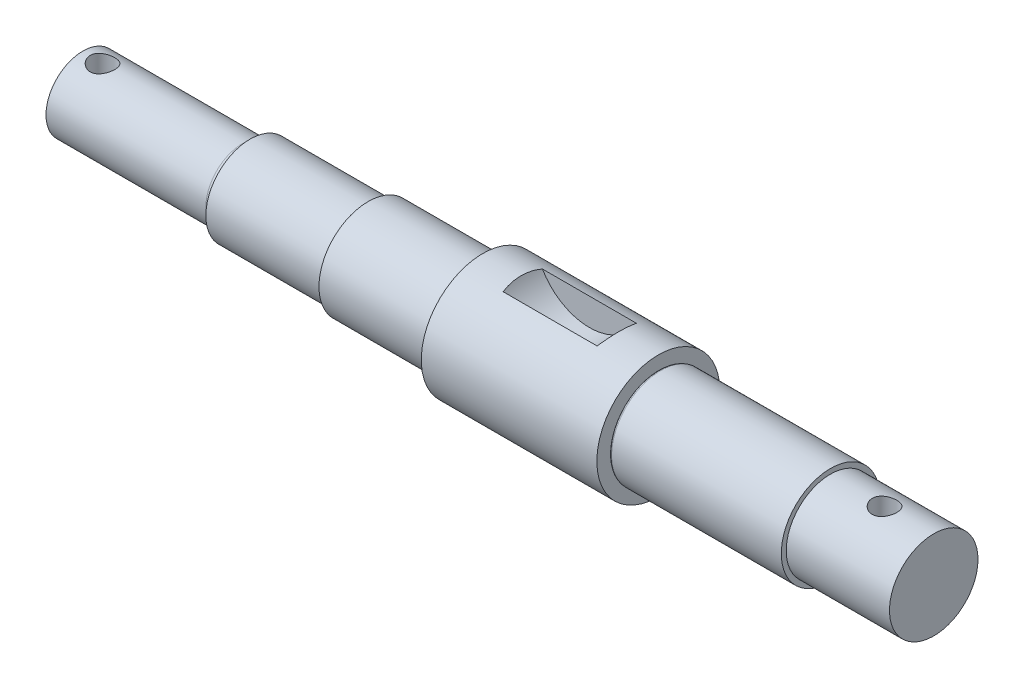
ISO-10303-21;
HEADER;
FILE_DESCRIPTION(('STEP AP214'),'2;1');
FILE_NAME('part.step','',(''),(''),'','','');
FILE_SCHEMA(('AUTOMOTIVE_DESIGN { 1 0 10303 214 1 1 1 1 }'));
ENDSEC;
DATA;
#1=APPLICATION_CONTEXT('core data for automotive mechanical design processes');
#2=APPLICATION_PROTOCOL_DEFINITION('international standard','automotive_design',2000,#1);
#3=PRODUCT_CONTEXT('',#1,'mechanical');
#4=PRODUCT('Part','Part','',(#3));
#5=PRODUCT_RELATED_PRODUCT_CATEGORY('part','',(#4));
#6=PRODUCT_DEFINITION_FORMATION('','',#4);
#7=PRODUCT_DEFINITION_CONTEXT('part definition',#1,'design');
#8=PRODUCT_DEFINITION('design','',#6,#7);
#9=PRODUCT_DEFINITION_SHAPE('','',#8);
#10=(LENGTH_UNIT() NAMED_UNIT(*) SI_UNIT(.MILLI.,.METRE.));
#11=(NAMED_UNIT(*) PLANE_ANGLE_UNIT() SI_UNIT($,.RADIAN.));
#12=(NAMED_UNIT(*) SI_UNIT($,.STERADIAN.) SOLID_ANGLE_UNIT());
#13=UNCERTAINTY_MEASURE_WITH_UNIT(LENGTH_MEASURE(1.E-05),#10,'distance_accuracy_value','');
#14=(GEOMETRIC_REPRESENTATION_CONTEXT(3) GLOBAL_UNCERTAINTY_ASSIGNED_CONTEXT((#13)) GLOBAL_UNIT_ASSIGNED_CONTEXT((#10,
#11,#12)) REPRESENTATION_CONTEXT('',''));
#15=CARTESIAN_POINT('',(0.,0.,0.));
#16=DIRECTION('',(0.,0.,1.));
#17=DIRECTION('',(1.,0.,0.));
#18=AXIS2_PLACEMENT_3D('',#15,#16,#17);
#19=CARTESIAN_POINT('',(-70.7,0.,0.));
#20=DIRECTION('',(1.,0.,0.));
#21=DIRECTION('',(0.,0.,-1.));
#22=AXIS2_PLACEMENT_3D('',#19,#20,#21);
#23=CYLINDRICAL_SURFACE('',#22,12.5);
#24=DIRECTION('',(1.,0.,0.));
#25=VECTOR('',#24,1.);
#26=CARTESIAN_POINT('',(-70.7,11.842719282327,4.));
#27=LINE('',#26,#25);
#28=CARTESIAN_POINT('',(-62.5508160472556,11.842719282327,4.));
#29=VERTEX_POINT('',#28);
#30=CARTESIAN_POINT('',(-43.4491839527444,11.842719282327,4.));
#31=VERTEX_POINT('',#30);
#32=EDGE_CURVE('E12',#29,#31,#27,.T.);
#33=ORIENTED_EDGE('',*,*,#32,.F.);
#34=CARTESIAN_POINT('',(-62.5508160472556,11.842719282327,4.));
#35=CARTESIAN_POINT('',(-62.5788073169737,11.8917156117758,3.85494402529168));
#36=CARTESIAN_POINT('',(-62.6048446524749,11.9381490672679,3.70867030879479));
#37=CARTESIAN_POINT('',(-62.6532244024329,12.0257437372073,3.41395853570055));
#38=CARTESIAN_POINT('',(-62.6755670398605,12.0669052697751,3.26552061029944));
#39=CARTESIAN_POINT('',(-62.7373575421085,12.1822344055781,2.81748164136339));
#40=CARTESIAN_POINT('',(-62.7715940017447,12.2482930461569,2.51501804161142));
#41=CARTESIAN_POINT('',(-62.8275364300656,12.3580046221654,1.90427101375401));
#42=CARTESIAN_POINT('',(-62.849214490821,12.4016076318492,1.59597618401057));
#43=CARTESIAN_POINT('',(-62.8808309020949,12.4656995854591,0.976382997723515));
#44=CARTESIAN_POINT('',(-62.8907689415353,12.4861879169095,0.665084561812988));
#45=CARTESIAN_POINT('',(-62.8993283672537,12.5038147620794,0.0418568247993382));
#46=CARTESIAN_POINT('',(-62.8979562431907,12.500966666014,-0.27007201186877));
#47=CARTESIAN_POINT('',(-62.8838499432114,12.4719806173032,-0.892642047172861));
#48=CARTESIAN_POINT('',(-62.8711140781979,12.4458392023584,-1.20328304748954));
#49=CARTESIAN_POINT('',(-62.8337853276926,12.3706573639039,-1.82020810943419));
#50=CARTESIAN_POINT('',(-62.8092242302907,12.3216783425543,-2.12650159839236));
#51=CARTESIAN_POINT('',(-62.7472667264495,12.201434168835,-2.7332260557265));
#52=CARTESIAN_POINT('',(-62.7098785640084,12.130183333244,-3.03366065887987));
#53=CARTESIAN_POINT('',(-62.6484087093215,12.0170604757192,-3.44296739669273));
#54=CARTESIAN_POINT('',(-62.6304071211959,11.9842876759461,-3.55535041723218));
#55=CARTESIAN_POINT('',(-62.5922518337805,11.9157411691357,-3.77872220549977));
#56=CARTESIAN_POINT('',(-62.5720999563678,11.8799700079478,-3.88971206587698));
#57=CARTESIAN_POINT('',(-62.5508160472556,11.842719282327,-4.));
#58=B_SPLINE_CURVE_WITH_KNOTS('',3,(#34,#35,#36,#37,#38,#39,#40,#41,#42,#43,#44,#45,#46,#47,#48,
#49,#50,#51,#52,#53,#54,#55,#56,#57),.UNSPECIFIED.,.F.,.F.,(4,2,2,2,2,2,2,2,2,2,2,4),(0.,
0.466853020500423,0.933677856670472,1.86688702951263,2.80216215102911,3.73746205419399,
4.67222532897255,5.60712756936481,6.53953055913783,7.4713354094899,7.82660392793133,
8.18157379263428),.UNSPECIFIED.);
#59=CARTESIAN_POINT('',(-62.5508160472556,11.842719282327,-4.));
#60=VERTEX_POINT('',#59);
#61=EDGE_CURVE('E55',#29,#60,#58,.T.);
#62=ORIENTED_EDGE('',*,*,#61,.T.);
#63=DIRECTION('',(1.,0.,0.));
#64=VECTOR('',#63,1.);
#65=CARTESIAN_POINT('',(-70.7,11.842719282327,-4.));
#66=LINE('',#65,#64);
#67=CARTESIAN_POINT('',(-43.4491839527444,11.842719282327,-4.));
#68=VERTEX_POINT('',#67);
#69=EDGE_CURVE('E73',#60,#68,#66,.T.);
#70=ORIENTED_EDGE('',*,*,#69,.T.);
#71=CARTESIAN_POINT('',(-43.4491839527444,11.842719282327,-4.));
#72=CARTESIAN_POINT('',(-43.4211926830263,11.8917156117758,-3.85494402529168));
#73=CARTESIAN_POINT('',(-43.3951553475251,11.9381490672679,-3.70867030879479));
#74=CARTESIAN_POINT('',(-43.3467755975671,12.0257437372073,-3.41395853570055));
#75=CARTESIAN_POINT('',(-43.3244329601395,12.0669052697751,-3.26552061029944));
#76=CARTESIAN_POINT('',(-43.2626424578915,12.1822344055781,-2.8174816413634));
#77=CARTESIAN_POINT('',(-43.2284059982553,12.2482930461569,-2.51501804161143));
#78=CARTESIAN_POINT('',(-43.1724635699344,12.3580046221654,-1.90427101375401));
#79=CARTESIAN_POINT('',(-43.150785509179,12.4016076318492,-1.59597618401057));
#80=CARTESIAN_POINT('',(-43.1191690979051,12.4656995854591,-0.976382997723515));
#81=CARTESIAN_POINT('',(-43.1092310584647,12.4861879169095,-0.665084561812988));
#82=CARTESIAN_POINT('',(-43.1006716327463,12.5038147620794,-0.0418568247993377));
#83=CARTESIAN_POINT('',(-43.1020437568093,12.500966666014,0.270072011868771));
#84=CARTESIAN_POINT('',(-43.1161500567886,12.4719806173032,0.892642047172861));
#85=CARTESIAN_POINT('',(-43.1288859218021,12.4458392023584,1.20328304748954));
#86=CARTESIAN_POINT('',(-43.1662146723074,12.3706573639039,1.82020810943419));
#87=CARTESIAN_POINT('',(-43.1907757697093,12.3216783425543,2.12650159839236));
#88=CARTESIAN_POINT('',(-43.2527332735505,12.201434168835,2.7332260557265));
#89=CARTESIAN_POINT('',(-43.2901214359916,12.130183333244,3.03366065887988));
#90=CARTESIAN_POINT('',(-43.3515912906785,12.0170604757192,3.44296739669273));
#91=CARTESIAN_POINT('',(-43.3695928788041,11.9842876759461,3.55535041723219));
#92=CARTESIAN_POINT('',(-43.4077481662195,11.9157411691357,3.77872220549976));
#93=CARTESIAN_POINT('',(-43.4279000436322,11.8799700079478,3.88971206587698));
#94=CARTESIAN_POINT('',(-43.4491839527444,11.842719282327,4.));
#95=B_SPLINE_CURVE_WITH_KNOTS('',3,(#71,#72,#73,#74,#75,#76,#77,#78,#79,#80,#81,#82,#83,#84,#85,
#86,#87,#88,#89,#90,#91,#92,#93,#94),.UNSPECIFIED.,.F.,.F.,(4,2,2,2,2,2,2,2,2,2,2,4),(0.,
0.466853020500425,0.93367785667047,1.86688702951263,2.80216215102911,3.73746205419399,
4.67222532897255,5.60712756936481,6.53953055913783,7.4713354094899,7.82660392793133,
8.18157379263428),.UNSPECIFIED.);
#96=EDGE_CURVE('E79',#68,#31,#95,.T.);
#97=ORIENTED_EDGE('',*,*,#96,.T.);
#98=EDGE_LOOP('',(#33,#62,#70,#97));
#99=FACE_BOUND('',#98,.T.);
#100=CARTESIAN_POINT('',(-70.7,0.,0.));
#101=DIRECTION('',(1.,0.,0.));
#102=DIRECTION('',(0.,0.,-1.));
#103=AXIS2_PLACEMENT_3D('',#100,#101,#102);
#104=CIRCLE('',#103,12.5);
#105=CARTESIAN_POINT('',(-70.7,0.,-12.5));
#106=VERTEX_POINT('',#105);
#107=EDGE_CURVE('E244',#106,#106,#104,.T.);
#108=ORIENTED_EDGE('',*,*,#107,.T.);
#109=EDGE_LOOP('',(#108));
#110=FACE_BOUND('',#109,.T.);
#111=CARTESIAN_POINT('',(-35.,0.,0.));
#112=DIRECTION('',(1.,0.,0.));
#113=DIRECTION('',(0.,0.,-1.));
#114=AXIS2_PLACEMENT_3D('',#111,#112,#113);
#115=CIRCLE('',#114,12.5);
#116=CARTESIAN_POINT('',(-35.,0.,-12.5));
#117=VERTEX_POINT('',#116);
#118=EDGE_CURVE('E251',#117,#117,#115,.T.);
#119=ORIENTED_EDGE('',*,*,#118,.F.);
#120=EDGE_LOOP('',(#119));
#121=FACE_BOUND('',#120,.T.);
#122=ADVANCED_FACE('F46',(#99,#110,#121),#23,.T.);
#123=CARTESIAN_POINT('',(-70.7,0.,0.));
#124=DIRECTION('',(1.,0.,0.));
#125=DIRECTION('',(0.,0.,-1.));
#126=AXIS2_PLACEMENT_3D('',#123,#124,#125);
#127=PLANE('',#126);
#128=CARTESIAN_POINT('',(-70.7,0.,0.));
#129=DIRECTION('',(1.,0.,0.));
#130=DIRECTION('',(0.,0.,-1.));
#131=AXIS2_PLACEMENT_3D('',#128,#129,#130);
#132=CIRCLE('',#131,10.5);
#133=CARTESIAN_POINT('',(-70.7,0.,-10.5));
#134=VERTEX_POINT('',#133);
#135=EDGE_CURVE('E80',#134,#134,#132,.T.);
#136=ORIENTED_EDGE('',*,*,#135,.T.);
#137=EDGE_LOOP('',(#136));
#138=FACE_BOUND('',#137,.T.);
#139=ORIENTED_EDGE('',*,*,#107,.F.);
#140=EDGE_LOOP('',(#139));
#141=FACE_BOUND('',#140,.T.);
#142=ADVANCED_FACE('F151',(#138,#141),#127,.F.);
#143=CARTESIAN_POINT('',(-35.,0.,0.));
#144=DIRECTION('',(1.,0.,0.));
#145=DIRECTION('',(0.,0.,-1.));
#146=AXIS2_PLACEMENT_3D('',#143,#144,#145);
#147=PLANE('',#146);
#148=ORIENTED_EDGE('',*,*,#118,.T.);
#149=EDGE_LOOP('',(#148));
#150=FACE_BOUND('',#149,.T.);
#151=ADVANCED_FACE('F149',(#150),#147,.T.);
#152=CARTESIAN_POINT('',(-94.,0.,0.));
#153=DIRECTION('',(1.,0.,0.));
#154=DIRECTION('',(0.,0.,-1.));
#155=AXIS2_PLACEMENT_3D('',#152,#153,#154);
#156=CYLINDRICAL_SURFACE('',#155,10.);
#157=CARTESIAN_POINT('',(-71.2,0.,0.));
#158=DIRECTION('',(1.,0.,0.));
#159=DIRECTION('',(0.,0.,-1.));
#160=AXIS2_PLACEMENT_3D('',#157,#158,#159);
#161=CIRCLE('',#160,10.);
#162=CARTESIAN_POINT('',(-71.2,0.,-10.));
#163=VERTEX_POINT('',#162);
#164=EDGE_CURVE('E243',#163,#163,#161,.F.);
#165=ORIENTED_EDGE('',*,*,#164,.T.);
#166=EDGE_LOOP('',(#165));
#167=FACE_BOUND('',#166,.T.);
#168=CARTESIAN_POINT('',(-94.,0.,0.));
#169=DIRECTION('',(-1.,0.,0.));
#170=DIRECTION('',(0.,0.,1.));
#171=AXIS2_PLACEMENT_3D('',#168,#169,#170);
#172=CIRCLE('',#171,10.);
#173=CARTESIAN_POINT('',(-94.,0.,10.));
#174=VERTEX_POINT('',#173);
#175=EDGE_CURVE('E265',#174,#174,#172,.T.);
#176=ORIENTED_EDGE('',*,*,#175,.F.);
#177=EDGE_LOOP('',(#176));
#178=FACE_BOUND('',#177,.T.);
#179=ADVANCED_FACE('F145',(#167,#178),#156,.T.);
#180=CARTESIAN_POINT('',(-94.,0.,0.));
#181=DIRECTION('',(-1.,0.,0.));
#182=DIRECTION('',(0.,0.,1.));
#183=AXIS2_PLACEMENT_3D('',#180,#181,#182);
#184=PLANE('',#183);
#185=CARTESIAN_POINT('',(-94.,0.,0.));
#186=DIRECTION('',(-1.,0.,0.));
#187=DIRECTION('',(0.,0.,1.));
#188=AXIS2_PLACEMENT_3D('',#185,#186,#187);
#189=CIRCLE('',#188,9.);
#190=CARTESIAN_POINT('',(-94.,0.,9.));
#191=VERTEX_POINT('',#190);
#192=EDGE_CURVE('E254',#191,#191,#189,.F.);
#193=ORIENTED_EDGE('',*,*,#192,.T.);
#194=EDGE_LOOP('',(#193));
#195=FACE_BOUND('',#194,.T.);
#196=ORIENTED_EDGE('',*,*,#175,.T.);
#197=EDGE_LOOP('',(#196));
#198=FACE_BOUND('',#197,.T.);
#199=ADVANCED_FACE('F141',(#195,#198),#184,.T.);
#200=CARTESIAN_POINT('',(-118.,0.,0.));
#201=DIRECTION('',(1.,0.,0.));
#202=DIRECTION('',(0.,0.,-1.));
#203=AXIS2_PLACEMENT_3D('',#200,#201,#202);
#204=CYLINDRICAL_SURFACE('',#203,9.);
#205=ORIENTED_EDGE('',*,*,#192,.F.);
#206=EDGE_LOOP('',(#205));
#207=FACE_BOUND('',#206,.T.);
#208=CARTESIAN_POINT('',(-118.,0.,0.));
#209=DIRECTION('',(-1.,0.,0.));
#210=DIRECTION('',(0.,0.,1.));
#211=AXIS2_PLACEMENT_3D('',#208,#209,#210);
#212=CIRCLE('',#211,9.);
#213=CARTESIAN_POINT('',(-118.,0.,9.));
#214=VERTEX_POINT('',#213);
#215=EDGE_CURVE('E237',#214,#214,#212,.T.);
#216=ORIENTED_EDGE('',*,*,#215,.F.);
#217=EDGE_LOOP('',(#216));
#218=FACE_BOUND('',#217,.T.);
#219=ADVANCED_FACE('F136',(#207,#218),#204,.T.);
#220=CARTESIAN_POINT('',(-102.,0.,0.));
#221=DIRECTION('',(-1.,0.,0.));
#222=DIRECTION('',(0.,0.,1.));
#223=AXIS2_PLACEMENT_3D('',#220,#221,#222);
#224=CYLINDRICAL_SURFACE('',#223,7.5);
#225=CARTESIAN_POINT('',(-148.,-7.07106781186548,2.5));
#226=CARTESIAN_POINT('',(-148.13617043709,-7.07106736326085,2.50000064486928));
#227=CARTESIAN_POINT('',(-148.272336999559,-7.07504423227144,2.4888369592138));
#228=CARTESIAN_POINT('',(-148.540636052486,-7.09043935203137,2.44462782922201));
#229=CARTESIAN_POINT('',(-148.672767874681,-7.10185882855472,2.41157878042099));
#230=CARTESIAN_POINT('',(-148.929067232493,-7.13070509221979,2.32488871421226));
#231=CARTESIAN_POINT('',(-149.053249823607,-7.14812009928305,2.27128805350811));
#232=CARTESIAN_POINT('',(-149.29090012137,-7.18697805025812,2.14515407110345));
#233=CARTESIAN_POINT('',(-149.404365456384,-7.20842188259031,2.07261657215046));
#234=CARTESIAN_POINT('',(-149.621799905846,-7.25386223518683,1.9076278661072));
#235=CARTESIAN_POINT('',(-149.725288571679,-7.27792237111609,1.81456085344481));
#236=CARTESIAN_POINT('',(-149.915517003062,-7.32534662002507,1.61246916803601));
#237=CARTESIAN_POINT('',(-150.002254078956,-7.34871062072404,1.50344193763096));
#238=CARTESIAN_POINT('',(-150.158697243324,-7.39284667304497,1.26901126991254));
#239=CARTESIAN_POINT('',(-150.227899926545,-7.41353519254013,1.14325477806133));
#240=CARTESIAN_POINT('',(-150.343978962819,-7.44923966927457,0.881078057468701));
#241=CARTESIAN_POINT('',(-150.390861332942,-7.46425715507505,0.744660714218043));
#242=CARTESIAN_POINT('',(-150.459339636581,-7.48647688579767,0.470072043583746));
#243=CARTESIAN_POINT('',(-150.481758615643,-7.49393286943898,0.332126887132431));
#244=CARTESIAN_POINT('',(-150.503290733402,-7.5010902054562,0.054244687060235));
#245=CARTESIAN_POINT('',(-150.502409879131,-7.50079355657239,-0.085691833859729));
#246=CARTESIAN_POINT('',(-150.477889363585,-7.49265099046828,-0.357758787984523));
#247=CARTESIAN_POINT('',(-150.455143678814,-7.48510161887793,-0.489980121479126));
#248=CARTESIAN_POINT('',(-150.389017547549,-7.46367418349329,-0.748608597055414));
#249=CARTESIAN_POINT('',(-150.34563570255,-7.44979569077954,-0.875015344448026));
#250=CARTESIAN_POINT('',(-150.238946706735,-7.41689175733061,-1.12038118710492));
#251=CARTESIAN_POINT('',(-150.175385153634,-7.39780106310039,-1.2392205524221));
#252=CARTESIAN_POINT('',(-150.030350736378,-7.35645982597298,-1.4648108138183));
#253=CARTESIAN_POINT('',(-149.948872891681,-7.33420840503667,-1.57155833596334));
#254=CARTESIAN_POINT('',(-149.765814016351,-7.28765479624742,-1.77525216637825));
#255=CARTESIAN_POINT('',(-149.663467105396,-7.26330537922195,-1.87150039266315));
#256=CARTESIAN_POINT('',(-149.443878185684,-7.21618338122252,-2.04569314899541));
#257=CARTESIAN_POINT('',(-149.32663388568,-7.19341104364039,-2.12363485820384));
#258=CARTESIAN_POINT('',(-149.078365935991,-7.15176312802781,-2.25996863758935));
#259=CARTESIAN_POINT('',(-148.947169671706,-7.1329477321187,-2.31806615905335));
#260=CARTESIAN_POINT('',(-148.676071514464,-7.10204127060962,-2.41110798317333));
#261=CARTESIAN_POINT('',(-148.536173296984,-7.08994738717732,-2.44606198936873));
#262=CARTESIAN_POINT('',(-148.258404111471,-7.07449090788963,-2.4904032052438));
#263=CARTESIAN_POINT('',(-148.120726438128,-7.0707590079689,-2.50087273876907));
#264=CARTESIAN_POINT('',(-147.845559627215,-7.07141680147961,-2.4990135972743));
#265=CARTESIAN_POINT('',(-147.70807045994,-7.07580501979536,-2.48668906306691));
#266=CARTESIAN_POINT('',(-147.44210758572,-7.09184045225748,-2.44056412888077));
#267=CARTESIAN_POINT('',(-147.313486424623,-7.10323313602101,-2.40751598495171));
#268=CARTESIAN_POINT('',(-147.063640984402,-7.13171384177557,-2.32178465640117));
#269=CARTESIAN_POINT('',(-146.942418021023,-7.14880287337099,-2.26909799090856));
#270=CARTESIAN_POINT('',(-146.706548947883,-7.18742193989467,-2.14368585184735));
#271=CARTESIAN_POINT('',(-146.592233393396,-7.2090756416407,-2.07037779589625));
#272=CARTESIAN_POINT('',(-146.377134869041,-7.25414421827413,-1.90646407639391));
#273=CARTESIAN_POINT('',(-146.276355903347,-7.27755961109485,-1.81585331374697));
#274=CARTESIAN_POINT('',(-146.086180039773,-7.32487596594622,-1.61472926475083));
#275=CARTESIAN_POINT('',(-145.997564024953,-7.34874608944741,-1.50346817636665));
#276=CARTESIAN_POINT('',(-145.84020964413,-7.39317129032772,-1.26706822850066));
#277=CARTESIAN_POINT('',(-145.771470572094,-7.41372648544237,-1.1419298621614));
#278=CARTESIAN_POINT('',(-145.656449737846,-7.44911014526507,-0.881949656080751));
#279=CARTESIAN_POINT('',(-145.61002180713,-7.46397575011328,-0.747177808303002));
#280=CARTESIAN_POINT('',(-145.54068064485,-7.48646527094436,-0.471146164615052));
#281=CARTESIAN_POINT('',(-145.517758925299,-7.49409180085047,-0.329888729884737));
#282=CARTESIAN_POINT('',(-145.496844805986,-7.50104658090641,-0.0520383396501172));
#283=CARTESIAN_POINT('',(-145.497731365169,-7.50074800223598,0.0844618098000325));
#284=CARTESIAN_POINT('',(-145.521643270366,-7.49280491298495,0.355277862500421));
#285=CARTESIAN_POINT('',(-145.544666820382,-7.48516099833939,0.489593942047627));
#286=CARTESIAN_POINT('',(-145.61145558644,-7.46352287386031,0.750105298580132));
#287=CARTESIAN_POINT('',(-145.654885538382,-7.44963145902872,0.87639567728196));
#288=CARTESIAN_POINT('',(-145.760943827743,-7.41692901761238,1.11994587734948));
#289=CARTESIAN_POINT('',(-145.823575637993,-7.39811710120041,1.23720406035606));
#290=CARTESIAN_POINT('',(-145.968923780255,-7.35664672069703,1.46408504077195));
#291=CARTESIAN_POINT('',(-146.052296713454,-7.33387181229817,1.573265628894));
#292=CARTESIAN_POINT('',(-146.235643477891,-7.28732471979699,1.77645256568106));
#293=CARTESIAN_POINT('',(-146.335622605657,-7.26355221932743,1.87045405406147));
#294=CARTESIAN_POINT('',(-146.554023388967,-7.21658199563996,2.04435452208278));
#295=CARTESIAN_POINT('',(-146.673013777442,-7.19344319971577,2.12355741499473));
#296=CARTESIAN_POINT('',(-146.923336067257,-7.15150483307539,2.26078585825277));
#297=CARTESIAN_POINT('',(-147.054664732574,-7.13270412903124,2.31881694204867));
#298=CARTESIAN_POINT('',(-147.319904560039,-7.10253335516287,2.4096095705104));
#299=CARTESIAN_POINT('',(-147.453430658813,-7.09086582142956,2.44339477287379));
#300=CARTESIAN_POINT('',(-147.724640126167,-7.07513458848796,2.48858580037316));
#301=CARTESIAN_POINT('',(-147.862322043527,-7.07106826543653,2.49999934799148));
#302=CARTESIAN_POINT('',(-148.,-7.07106781186548,2.5));
#303=B_SPLINE_CURVE_WITH_KNOTS('',3,(#225,#226,#227,#228,#229,#230,#231,#232,#233,#234,#235,
#236,#237,#238,#239,#240,#241,#242,#243,#244,#245,#246,#247,#248,#249,#250,#251,#252,#253,#254,
#255,#256,#257,#258,#259,#260,#261,#262,#263,#264,#265,#266,#267,#268,#269,#270,#271,#272,#273,
#274,#275,#276,#277,#278,#279,#280,#281,#282,#283,#284,#285,#286,#287,#288,#289,#290,#291,#292,
#293,#294,#295,#296,#297,#298,#299,#300,#301,#302),.UNSPECIFIED.,.T.,.F.,(4,2,2,2,2,2,2,2,2,2,2,
2,2,2,2,2,2,2,2,2,2,2,2,2,2,2,2,2,2,2,2,2,2,2,2,2,2,2,4),(0.,0.408001461998432,
0.816070137537893,1.22334156875206,1.63070291546358,2.05253343568916,2.47443162929966,
2.90733765359139,3.3401269096697,3.75785796912333,4.17548133255815,4.5767251206392,
4.97799610473088,5.38454137150835,5.79119979685051,6.21700435909789,6.6428744903026,
7.07481599607639,7.50657628391536,7.9188572841109,8.33106339593081,8.72910989421938,
9.12722697867362,9.53797144339281,9.94883714155314,10.3794702042773,10.8100879689383,
11.2378447797712,11.6654470751039,12.0729521169408,12.4804241002445,12.8814239010107,
13.282496269081,13.6983879880158,14.1144126108157,14.5467225684035,14.9789194566716,
15.3915803040672,15.8040986797615),.UNSPECIFIED.);
#304=CARTESIAN_POINT('',(-148.,-7.07106781186548,2.5));
#305=VERTEX_POINT('',#304);
#306=EDGE_CURVE('E125',#305,#305,#303,.T.);
#307=ORIENTED_EDGE('',*,*,#306,.F.);
#308=EDGE_LOOP('',(#307));
#309=FACE_BOUND('',#308,.T.);
#310=CARTESIAN_POINT('',(-148.,7.07106781186548,2.5));
#311=CARTESIAN_POINT('',(-147.86382956291,7.07106736326085,2.50000064486928));
#312=CARTESIAN_POINT('',(-147.727663000441,7.07504423227144,2.4888369592138));
#313=CARTESIAN_POINT('',(-147.459363947514,7.09043935203137,2.44462782922201));
#314=CARTESIAN_POINT('',(-147.327232125319,7.10185882855472,2.41157878042099));
#315=CARTESIAN_POINT('',(-147.070932767507,7.13070509221979,2.32488871421226));
#316=CARTESIAN_POINT('',(-146.946750176393,7.14812009928305,2.27128805350811));
#317=CARTESIAN_POINT('',(-146.70909987863,7.18697805025812,2.14515407110345));
#318=CARTESIAN_POINT('',(-146.595634543616,7.20842188259031,2.07261657215046));
#319=CARTESIAN_POINT('',(-146.378200094154,7.25386223518683,1.9076278661072));
#320=CARTESIAN_POINT('',(-146.274711428321,7.27792237111609,1.81456085344481));
#321=CARTESIAN_POINT('',(-146.084482996938,7.32534662002507,1.61246916803601));
#322=CARTESIAN_POINT('',(-145.997745921044,7.34871062072404,1.50344193763096));
#323=CARTESIAN_POINT('',(-145.841302756676,7.39284667304497,1.26901126991254));
#324=CARTESIAN_POINT('',(-145.772100073455,7.41353519254014,1.14325477806132));
#325=CARTESIAN_POINT('',(-145.656021037181,7.44923966927457,0.88107805746869));
#326=CARTESIAN_POINT('',(-145.609138667058,7.46425715507505,0.744660714218036));
#327=CARTESIAN_POINT('',(-145.540660363419,7.48647688579767,0.470072043583745));
#328=CARTESIAN_POINT('',(-145.518241384358,7.49393286943898,0.332126887132431));
#329=CARTESIAN_POINT('',(-145.496709266598,7.5010902054562,0.0542446870602354));
#330=CARTESIAN_POINT('',(-145.497590120869,7.50079355657239,-0.085691833859729));
#331=CARTESIAN_POINT('',(-145.522110636415,7.49265099046828,-0.357758787984523));
#332=CARTESIAN_POINT('',(-145.544856321186,7.48510161887793,-0.489980121479126));
#333=CARTESIAN_POINT('',(-145.610982452451,7.46367418349329,-0.748608597055414));
#334=CARTESIAN_POINT('',(-145.65436429745,7.44979569077954,-0.875015344448027));
#335=CARTESIAN_POINT('',(-145.761053293265,7.41689175733061,-1.12038118710492));
#336=CARTESIAN_POINT('',(-145.824614846366,7.39780106310039,-1.23922055242209));
#337=CARTESIAN_POINT('',(-145.969649263622,7.35645982597298,-1.46481081381829));
#338=CARTESIAN_POINT('',(-146.051127108319,7.33420840503667,-1.57155833596334));
#339=CARTESIAN_POINT('',(-146.234185983649,7.28765479624742,-1.77525216637825));
#340=CARTESIAN_POINT('',(-146.336532894604,7.26330537922195,-1.87150039266315));
#341=CARTESIAN_POINT('',(-146.556121814317,7.21618338122252,-2.04569314899541));
#342=CARTESIAN_POINT('',(-146.67336611432,7.19341104364039,-2.12363485820384));
#343=CARTESIAN_POINT('',(-146.921634064009,7.15176312802781,-2.25996863758935));
#344=CARTESIAN_POINT('',(-147.052830328294,7.1329477321187,-2.31806615905335));
#345=CARTESIAN_POINT('',(-147.323928485536,7.10204127060962,-2.41110798317333));
#346=CARTESIAN_POINT('',(-147.463826703016,7.08994738717732,-2.44606198936873));
#347=CARTESIAN_POINT('',(-147.741595888529,7.07449090788963,-2.4904032052438));
#348=CARTESIAN_POINT('',(-147.879273561872,7.0707590079689,-2.50087273876908));
#349=CARTESIAN_POINT('',(-148.154440372785,7.07141680147961,-2.49901359727429));
#350=CARTESIAN_POINT('',(-148.29192954006,7.07580501979536,-2.4866890630669));
#351=CARTESIAN_POINT('',(-148.55789241428,7.09184045225748,-2.44056412888077));
#352=CARTESIAN_POINT('',(-148.686513575377,7.10323313602101,-2.40751598495171));
#353=CARTESIAN_POINT('',(-148.936359015598,7.13171384177557,-2.32178465640117));
#354=CARTESIAN_POINT('',(-149.057581978977,7.14880287337099,-2.26909799090856));
#355=CARTESIAN_POINT('',(-149.293451052117,7.18742193989467,-2.14368585184735));
#356=CARTESIAN_POINT('',(-149.407766606604,7.2090756416407,-2.07037779589625));
#357=CARTESIAN_POINT('',(-149.622865130959,7.25414421827413,-1.90646407639391));
#358=CARTESIAN_POINT('',(-149.723644096653,7.27755961109485,-1.81585331374697));
#359=CARTESIAN_POINT('',(-149.913819960227,7.32487596594622,-1.61472926475082));
#360=CARTESIAN_POINT('',(-150.002435975047,7.34874608944741,-1.50346817636663));
#361=CARTESIAN_POINT('',(-150.15979035587,7.39317129032772,-1.26706822850064));
#362=CARTESIAN_POINT('',(-150.228529427906,7.41372648544237,-1.14192986216139));
#363=CARTESIAN_POINT('',(-150.343550262154,7.44911014526507,-0.88194965608075));
#364=CARTESIAN_POINT('',(-150.38997819287,7.46397575011328,-0.747177808303002));
#365=CARTESIAN_POINT('',(-150.45931935515,7.48646527094436,-0.471146164615053));
#366=CARTESIAN_POINT('',(-150.482241074701,7.49409180085047,-0.329888729884737));
#367=CARTESIAN_POINT('',(-150.503155194014,7.50104658090641,-0.0520383396501171));
#368=CARTESIAN_POINT('',(-150.502268634831,7.50074800223598,0.0844618098000325));
#369=CARTESIAN_POINT('',(-150.478356729634,7.49280491298495,0.355277862500421));
#370=CARTESIAN_POINT('',(-150.455333179618,7.48516099833939,0.489593942047627));
#371=CARTESIAN_POINT('',(-150.38854441356,7.46352287386031,0.750105298580132));
#372=CARTESIAN_POINT('',(-150.345114461618,7.44963145902872,0.87639567728196));
#373=CARTESIAN_POINT('',(-150.239056172257,7.41692901761238,1.11994587734948));
#374=CARTESIAN_POINT('',(-150.176424362007,7.39811710120041,1.23720406035606));
#375=CARTESIAN_POINT('',(-150.031076219745,7.35664672069703,1.46408504077195));
#376=CARTESIAN_POINT('',(-149.947703286546,7.33387181229817,1.573265628894));
#377=CARTESIAN_POINT('',(-149.76435652211,7.28732471979699,1.77645256568106));
#378=CARTESIAN_POINT('',(-149.664377394343,7.26355221932743,1.87045405406147));
#379=CARTESIAN_POINT('',(-149.445976611033,7.21658199563996,2.04435452208278));
#380=CARTESIAN_POINT('',(-149.326986222558,7.19344319971577,2.12355741499473));
#381=CARTESIAN_POINT('',(-149.076663932743,7.15150483307539,2.26078585825277));
#382=CARTESIAN_POINT('',(-148.945335267426,7.13270412903124,2.31881694204867));
#383=CARTESIAN_POINT('',(-148.680095439961,7.10253335516287,2.4096095705104));
#384=CARTESIAN_POINT('',(-148.546569341187,7.09086582142956,2.44339477287379));
#385=CARTESIAN_POINT('',(-148.275359873833,7.07513458848796,2.48858580037316));
#386=CARTESIAN_POINT('',(-148.137677956473,7.07106826543653,2.49999934799148));
#387=CARTESIAN_POINT('',(-148.,7.07106781186548,2.5));
#388=B_SPLINE_CURVE_WITH_KNOTS('',3,(#310,#311,#312,#313,#314,#315,#316,#317,#318,#319,#320,
#321,#322,#323,#324,#325,#326,#327,#328,#329,#330,#331,#332,#333,#334,#335,#336,#337,#338,#339,
#340,#341,#342,#343,#344,#345,#346,#347,#348,#349,#350,#351,#352,#353,#354,#355,#356,#357,#358,
#359,#360,#361,#362,#363,#364,#365,#366,#367,#368,#369,#370,#371,#372,#373,#374,#375,#376,#377,
#378,#379,#380,#381,#382,#383,#384,#385,#386,#387),.UNSPECIFIED.,.T.,.F.,(4,2,2,2,2,2,2,2,2,2,2,
2,2,2,2,2,2,2,2,2,2,2,2,2,2,2,2,2,2,2,2,2,2,2,2,2,2,2,4),(0.,0.408001461998432,
0.816070137537893,1.22334156875206,1.63070291546358,2.05253343568916,2.47443162929966,
2.90733765359142,3.3401269096697,3.75785796912334,4.17548133255816,4.5767251206392,
4.97799610473089,5.38454137150835,5.79119979685051,6.21700435909789,6.64287449030261,
7.07481599607639,7.50657628391536,7.91885728411101,8.33106339593082,8.72910989421938,
9.12722697867362,9.53797144339281,9.94883714155315,10.3794702042773,10.8100879689383,
11.2378447797712,11.6654470751039,12.0729521169408,12.4804241002445,12.8814239010107,
13.282496269081,13.6983879880158,14.1144126108157,14.5467225684035,14.9789194566716,
15.3915803040672,15.8040986797616),.UNSPECIFIED.);
#389=CARTESIAN_POINT('',(-148.,7.07106781186548,2.5));
#390=VERTEX_POINT('',#389);
#391=EDGE_CURVE('E119',#390,#390,#388,.T.);
#392=ORIENTED_EDGE('',*,*,#391,.F.);
#393=EDGE_LOOP('',(#392));
#394=FACE_BOUND('',#393,.T.);
#395=CARTESIAN_POINT('',(-119.5,0.,0.));
#396=DIRECTION('',(-1.,0.,0.));
#397=DIRECTION('',(0.,0.,1.));
#398=AXIS2_PLACEMENT_3D('',#395,#396,#397);
#399=CIRCLE('',#398,7.5);
#400=CARTESIAN_POINT('',(-119.5,0.,7.5));
#401=VERTEX_POINT('',#400);
#402=EDGE_CURVE('E240',#401,#401,#399,.T.);
#403=ORIENTED_EDGE('',*,*,#402,.T.);
#404=EDGE_LOOP('',(#403));
#405=FACE_BOUND('',#404,.T.);
#406=CARTESIAN_POINT('',(-152.,0.,0.));
#407=DIRECTION('',(-1.,0.,0.));
#408=DIRECTION('',(0.,0.,1.));
#409=AXIS2_PLACEMENT_3D('',#406,#407,#408);
#410=CIRCLE('',#409,7.5);
#411=CARTESIAN_POINT('',(-152.,0.,7.5));
#412=VERTEX_POINT('',#411);
#413=EDGE_CURVE('E131',#412,#412,#410,.T.);
#414=ORIENTED_EDGE('',*,*,#413,.F.);
#415=EDGE_LOOP('',(#414));
#416=FACE_BOUND('',#415,.T.);
#417=ADVANCED_FACE('F132',(#309,#394,#405,#416),#224,.T.);
#418=CARTESIAN_POINT('',(-152.,0.,0.));
#419=DIRECTION('',(-1.,0.,0.));
#420=DIRECTION('',(0.,0.,1.));
#421=AXIS2_PLACEMENT_3D('',#418,#419,#420);
#422=PLANE('',#421);
#423=ORIENTED_EDGE('',*,*,#413,.T.);
#424=EDGE_LOOP('',(#423));
#425=FACE_BOUND('',#424,.T.);
#426=ADVANCED_FACE('F115',(#425),#422,.T.);
#427=CARTESIAN_POINT('',(-119.5,0.,0.));
#428=DIRECTION('',(-1.,0.,0.));
#429=DIRECTION('',(0.,0.,1.));
#430=AXIS2_PLACEMENT_3D('',#427,#428,#429);
#431=TOROIDAL_SURFACE('',#430,9.,1.5);
#432=ORIENTED_EDGE('',*,*,#215,.T.);
#433=EDGE_LOOP('',(#432));
#434=FACE_BOUND('',#433,.T.);
#435=ORIENTED_EDGE('',*,*,#402,.F.);
#436=EDGE_LOOP('',(#435));
#437=FACE_BOUND('',#436,.T.);
#438=ADVANCED_FACE('F175',(#434,#437),#431,.F.);
#439=CARTESIAN_POINT('',(-71.2,0.,0.));
#440=DIRECTION('',(1.,0.,0.));
#441=DIRECTION('',(0.,0.,-1.));
#442=AXIS2_PLACEMENT_3D('',#439,#440,#441);
#443=TOROIDAL_SURFACE('',#442,10.5,0.5);
#444=ORIENTED_EDGE('',*,*,#135,.F.);
#445=EDGE_LOOP('',(#444));
#446=FACE_BOUND('',#445,.T.);
#447=ORIENTED_EDGE('',*,*,#164,.F.);
#448=EDGE_LOOP('',(#447));
#449=FACE_BOUND('',#448,.T.);
#450=ADVANCED_FACE('F48',(#446,#449),#443,.F.);
#451=CARTESIAN_POINT('',(-148.,-20.,0.));
#452=DIRECTION('',(0.,1.,0.));
#453=DIRECTION('',(0.,0.,1.));
#454=AXIS2_PLACEMENT_3D('',#451,#452,#453);
#455=CYLINDRICAL_SURFACE('',#454,2.5);
#456=ORIENTED_EDGE('',*,*,#306,.T.);
#457=EDGE_LOOP('',(#456));
#458=FACE_BOUND('',#457,.T.);
#459=ORIENTED_EDGE('',*,*,#391,.T.);
#460=EDGE_LOOP('',(#459));
#461=FACE_BOUND('',#460,.T.);
#462=ADVANCED_FACE('F108',(#458,#461),#455,.F.);
#463=CARTESIAN_POINT('',(-53.,17.3,4.));
#464=DIRECTION('',(0.,0.,-1.));
#465=DIRECTION('',(-1.,0.,0.));
#466=AXIS2_PLACEMENT_3D('',#463,#464,#465);
#467=CYLINDRICAL_SURFACE('',#466,11.);
#468=CARTESIAN_POINT('',(-53.,17.3,4.));
#469=DIRECTION('',(0.,0.,1.));
#470=DIRECTION('',(1.,0.,0.));
#471=AXIS2_PLACEMENT_3D('',#468,#469,#470);
#472=CIRCLE('',#471,11.);
#473=EDGE_CURVE('E85',#29,#31,#472,.T.);
#474=ORIENTED_EDGE('',*,*,#473,.T.);
#475=ORIENTED_EDGE('',*,*,#96,.F.);
#476=CARTESIAN_POINT('',(-53.,17.3,-4.));
#477=DIRECTION('',(0.,0.,1.));
#478=DIRECTION('',(1.,0.,0.));
#479=AXIS2_PLACEMENT_3D('',#476,#477,#478);
#480=CIRCLE('',#479,11.);
#481=EDGE_CURVE('E61',#60,#68,#480,.T.);
#482=ORIENTED_EDGE('',*,*,#481,.F.);
#483=ORIENTED_EDGE('',*,*,#61,.F.);
#484=EDGE_LOOP('',(#474,#475,#482,#483));
#485=FACE_BOUND('',#484,.T.);
#486=ADVANCED_FACE('F83',(#485),#467,.F.);
#487=CARTESIAN_POINT('',(-53.,17.3,4.));
#488=DIRECTION('',(0.,0.,1.));
#489=DIRECTION('',(1.,0.,0.));
#490=AXIS2_PLACEMENT_3D('',#487,#488,#489);
#491=PLANE('',#490);
#492=ORIENTED_EDGE('',*,*,#32,.T.);
#493=ORIENTED_EDGE('',*,*,#473,.F.);
#494=EDGE_LOOP('',(#492,#493));
#495=FACE_BOUND('',#494,.T.);
#496=ADVANCED_FACE('F107',(#495),#491,.F.);
#497=CARTESIAN_POINT('',(-53.,17.3,-4.));
#498=DIRECTION('',(0.,0.,1.));
#499=DIRECTION('',(1.,0.,0.));
#500=AXIS2_PLACEMENT_3D('',#497,#498,#499);
#501=PLANE('',#500);
#502=ORIENTED_EDGE('',*,*,#481,.T.);
#503=ORIENTED_EDGE('',*,*,#69,.F.);
#504=EDGE_LOOP('',(#502,#503));
#505=FACE_BOUND('',#504,.T.);
#506=ADVANCED_FACE('F74',(#505),#501,.T.);
#507=CLOSED_SHELL('',(#122,#142,#151,#179,#199,#219,#417,#426,#438,#450,#462,#486,#496,#506));
#508=MANIFOLD_SOLID_BREP('B2',#507);
#509=CARTESIAN_POINT('',(21.,0.,0.));
#510=DIRECTION('',(-1.,0.,0.));
#511=DIRECTION('',(0.,0.,1.));
#512=AXIS2_PLACEMENT_3D('',#509,#510,#511);
#513=CYLINDRICAL_SURFACE('',#512,9.);
#514=CARTESIAN_POINT('',(11.,-8.64580823289529,2.5));
#515=CARTESIAN_POINT('',(11.1374869532899,-8.64581037496086,2.49999714996617));
#516=CARTESIAN_POINT('',(11.2750032400731,-8.64912360937159,2.48861977425243));
#517=CARTESIAN_POINT('',(11.5460485954312,-8.66197474072459,2.44350693717148));
#518=CARTESIAN_POINT('',(11.6795758552777,-8.67151541786232,2.40976148964065));
#519=CARTESIAN_POINT('',(11.9386823267595,-8.69565935423007,2.32112008680785));
#520=CARTESIAN_POINT('',(12.0642730407537,-8.71025507855494,2.26625559744293));
#521=CARTESIAN_POINT('',(12.3044909220554,-8.74285475062134,2.13703377417484));
#522=CARTESIAN_POINT('',(12.4191169742854,-8.76085904445198,2.06267446056935));
#523=CARTESIAN_POINT('',(12.6372618555828,-8.79879482245345,1.89441531907552));
#524=CARTESIAN_POINT('',(12.7404391176362,-8.81876275539879,1.80008077870936));
#525=CARTESIAN_POINT('',(12.9297308390393,-8.85806239814547,1.59548286960028));
#526=CARTESIAN_POINT('',(13.015843399965,-8.87739403696071,1.48521773095722));
#527=CARTESIAN_POINT('',(13.1700044611612,-8.91365202741973,1.249500428906));
#528=CARTESIAN_POINT('',(13.2377105918444,-8.93053038427289,1.12381632761083));
#529=CARTESIAN_POINT('',(13.3508992737597,-8.95956018312964,0.862300362049424));
#530=CARTESIAN_POINT('',(13.396385904574,-8.97171249276934,0.726470365890893));
#531=CARTESIAN_POINT('',(13.4627309454726,-8.98966318340413,0.452086360205862));
#532=CARTESIAN_POINT('',(13.4841710422613,-8.99561138050703,0.313682975067016));
#533=CARTESIAN_POINT('',(13.503647456656,-9.00100867384282,0.0351244568787275));
#534=CARTESIAN_POINT('',(13.5016880115567,-9.00045894674934,-0.105030354422778));
#535=CARTESIAN_POINT('',(13.4748244476162,-8.99303086374216,-0.379054247152546));
#536=CARTESIAN_POINT('',(13.4505492360309,-8.98632598075261,-0.512990410045098));
#537=CARTESIAN_POINT('',(13.3807628617674,-8.96754760099034,-0.774807483322482));
#538=CARTESIAN_POINT('',(13.3352504393449,-8.95547378574645,-0.90268803400609));
#539=CARTESIAN_POINT('',(13.2238179194169,-8.9270625060623,-1.15033359179948));
#540=CARTESIAN_POINT('',(13.1576880904757,-8.91068150784286,-1.26999902658788));
#541=CARTESIAN_POINT('',(13.0070603841802,-8.87541221350138,-1.49674457308826));
#542=CARTESIAN_POINT('',(12.922558667308,-8.85652339359456,-1.60382204684013));
#543=CARTESIAN_POINT('',(12.7342713422228,-8.81753663226074,-1.8061067603823));
#544=CARTESIAN_POINT('',(12.6299381943543,-8.79741936953618,-1.9008012505898));
#545=CARTESIAN_POINT('',(12.4066673248778,-8.75880383152746,-2.07148108085113));
#546=CARTESIAN_POINT('',(12.2877285498816,-8.74030567318147,-2.14746507027557));
#547=CARTESIAN_POINT('',(12.0374352785877,-8.70694013940655,-2.27900238121953));
#548=CARTESIAN_POINT('',(11.9059977306941,-8.69209980055975,-2.33440501640979));
#549=CARTESIAN_POINT('',(11.6351564042415,-8.66806022503139,-2.42215297643582));
#550=CARTESIAN_POINT('',(11.4957548077501,-8.65885945119346,-2.45450458459976));
#551=CARTESIAN_POINT('',(11.2177654860021,-8.64747148287153,-2.49432455486229));
#552=CARTESIAN_POINT('',(11.079296765191,-8.6450674615786,-2.50256249342185));
#553=CARTESIAN_POINT('',(10.8029580095482,-8.64694988564764,-2.49605092061448));
#554=CARTESIAN_POINT('',(10.6650879066499,-8.65123554925281,-2.48130409524808));
#555=CARTESIAN_POINT('',(10.3969022533087,-8.66580389953324,-2.42992241428478));
#556=CARTESIAN_POINT('',(10.2664883311528,-8.67595686836151,-2.39376059864354));
#557=CARTESIAN_POINT('',(10.0135797728991,-8.70098664146816,-2.30111259188306));
#558=CARTESIAN_POINT('',(9.89108623728039,-8.7158641004892,-2.24462358357885));
#559=CARTESIAN_POINT('',(9.65430463144223,-8.74910362417903,-2.11139571215836));
#560=CARTESIAN_POINT('',(9.5402782289618,-8.76753959855501,-2.03421067264883));
#561=CARTESIAN_POINT('',(9.32651375592426,-8.80564999409988,-1.86232721847474));
#562=CARTESIAN_POINT('',(9.22677861533554,-8.82532466803799,-1.76762522160664));
#563=CARTESIAN_POINT('',(9.04117852943156,-8.86445019939347,-1.55981743646719));
#564=CARTESIAN_POINT('',(8.95585318993223,-8.88387421295946,-1.44622359870981));
#565=CARTESIAN_POINT('',(8.80547602892254,-8.91967402878593,-1.20588311286948));
#566=CARTESIAN_POINT('',(8.74042313320582,-8.93604999253946,-1.07913716217183));
#567=CARTESIAN_POINT('',(8.6330504081766,-8.96380327787492,-0.816978395233256));
#568=CARTESIAN_POINT('',(8.59055883393278,-8.97521823979383,-0.681640101050666));
#569=CARTESIAN_POINT('',(8.52903182655925,-8.99192942838897,-0.405376312895355));
#570=CARTESIAN_POINT('',(8.50999071685639,-8.99722713582853,-0.264452179596265));
#571=CARTESIAN_POINT('',(8.49628567031372,-9.00103042209333,0.0139601523576469));
#572=CARTESIAN_POINT('',(8.50083329290933,-8.99975568986336,0.151407064589649));
#573=CARTESIAN_POINT('',(8.53232856249063,-8.99106088846503,0.423500619727718));
#574=CARTESIAN_POINT('',(8.55927523756996,-8.98364108593446,0.558147383873812));
#575=CARTESIAN_POINT('',(8.63434322362823,-8.96353984091205,0.819784983469305));
#576=CARTESIAN_POINT('',(8.68229259793326,-8.95090116936265,0.946828656281138));
#577=CARTESIAN_POINT('',(8.79785193823115,-8.92167820297651,1.19113920788314));
#578=CARTESIAN_POINT('',(8.86546483337858,-8.90509332036379,1.30840462671538));
#579=CARTESIAN_POINT('',(9.0206719427157,-8.86915397347007,1.53345112172909));
#580=CARTESIAN_POINT('',(9.10878008606865,-8.84973411731035,1.64086726646984));
#581=CARTESIAN_POINT('',(9.30151793045155,-8.81055920809079,1.83965563573724));
#582=CARTESIAN_POINT('',(9.40615209804751,-8.79080406570366,1.931023508681));
#583=CARTESIAN_POINT('',(9.63204451744418,-8.75263553519991,2.09734241907802));
#584=CARTESIAN_POINT('',(9.75364638953193,-8.73426670491594,2.17183796747973));
#585=CARTESIAN_POINT('',(10.0081439871788,-8.70160385709124,2.29922652645139));
#586=CARTESIAN_POINT('',(10.1410328731802,-8.68730739437859,2.35213250833712));
#587=CARTESIAN_POINT('',(10.3943601297383,-8.66621345779749,2.42859494882475));
#588=CARTESIAN_POINT('',(10.5137894055564,-8.65862660680177,2.45530563406018));
#589=CARTESIAN_POINT('',(10.7554716482243,-8.64842338463344,2.49100820491655));
#590=CARTESIAN_POINT('',(10.8777242232124,-8.64580632782193,2.50000253471396));
#591=CARTESIAN_POINT('',(11.,-8.64580823289529,2.5));
#592=B_SPLINE_CURVE_WITH_KNOTS('',3,(#514,#515,#516,#517,#518,#519,#520,#521,#522,#523,#524,
#525,#526,#527,#528,#529,#530,#531,#532,#533,#534,#535,#536,#537,#538,#539,#540,#541,#542,#543,
#544,#545,#546,#547,#548,#549,#550,#551,#552,#553,#554,#555,#556,#557,#558,#559,#560,#561,#562,
#563,#564,#565,#566,#567,#568,#569,#570,#571,#572,#573,#574,#575,#576,#577,#578,#579,#580,#581,
#582,#583,#584,#585,#586,#587,#588,#589,#590,#591),.UNSPECIFIED.,.T.,.F.,(4,2,2,2,2,2,2,2,2,2,2,
2,2,2,2,2,2,2,2,2,2,2,2,2,2,2,2,2,2,2,2,2,2,2,2,2,2,2,4),(0.,0.41201079168896,0.824205648454515,
1.23578872527857,1.64741361462616,2.0691389576003,2.49091119062405,2.92006196750631,
3.34913392107923,3.7675863122474,4.18596292931721,4.59289867518082,4.99985856264056,
5.4111013330343,5.82243013129567,6.24742875551483,6.672458049542,7.10054057407685,
7.5285063657189,7.94265637768504,8.35675799569095,8.76203677700911,9.16737174834454,
9.58226667645632,9.99724654423656,10.4253750626708,10.8534808913584,11.2782793253857,
11.7029749096957,12.1135686473819,12.5241445701257,12.9314203987337,13.3387569278366,
13.7576868945778,14.1767302818544,14.6060087946726,15.0350290098245,15.4015066296816,
15.7679336861631),.UNSPECIFIED.);
#593=CARTESIAN_POINT('',(11.,-8.64580823289529,2.5));
#594=VERTEX_POINT('',#593);
#595=EDGE_CURVE('E316',#594,#594,#592,.T.);
#596=ORIENTED_EDGE('',*,*,#595,.T.);
#597=EDGE_LOOP('',(#596));
#598=FACE_BOUND('',#597,.T.);
#599=CARTESIAN_POINT('',(11.,8.6458082328953,2.5));
#600=CARTESIAN_POINT('',(10.8625130467101,8.64581037496087,2.49999714996617));
#601=CARTESIAN_POINT('',(10.7249967599269,8.6491236093716,2.48861977425243));
#602=CARTESIAN_POINT('',(10.4539514045688,8.66197474072459,2.44350693717148));
#603=CARTESIAN_POINT('',(10.3204241447223,8.67151541786232,2.40976148964065));
#604=CARTESIAN_POINT('',(10.0613176732405,8.69565935423007,2.32112008680785));
#605=CARTESIAN_POINT('',(9.93572695924631,8.71025507855494,2.26625559744293));
#606=CARTESIAN_POINT('',(9.6955090779446,8.74285475062134,2.13703377417484));
#607=CARTESIAN_POINT('',(9.58088302571458,8.76085904445198,2.06267446056935));
#608=CARTESIAN_POINT('',(9.36273814441715,8.79879482245345,1.89441531907552));
#609=CARTESIAN_POINT('',(9.25956088236383,8.81876275539879,1.80008077870936));
#610=CARTESIAN_POINT('',(9.07026916096067,8.85806239814547,1.59548286960028));
#611=CARTESIAN_POINT('',(8.98415660003501,8.87739403696071,1.48521773095722));
#612=CARTESIAN_POINT('',(8.82999553883878,8.91365202741973,1.249500428906));
#613=CARTESIAN_POINT('',(8.7622894081556,8.93053038427289,1.12381632761083));
#614=CARTESIAN_POINT('',(8.6491007262403,8.95956018312964,0.862300362049423));
#615=CARTESIAN_POINT('',(8.60361409542603,8.97171249276934,0.726470365890892));
#616=CARTESIAN_POINT('',(8.53726905452741,8.98966318340413,0.452086360205861));
#617=CARTESIAN_POINT('',(8.51582895773871,8.99561138050703,0.313682975067015));
#618=CARTESIAN_POINT('',(8.49635254334397,9.00100867384282,0.0351244568787267));
#619=CARTESIAN_POINT('',(8.49831198844328,9.00045894674934,-0.105030354422778));
#620=CARTESIAN_POINT('',(8.52517555238381,8.99303086374216,-0.379054247152546));
#621=CARTESIAN_POINT('',(8.54945076396907,8.98632598075261,-0.512990410045098));
#622=CARTESIAN_POINT('',(8.61923713823255,8.96754760099034,-0.774807483322481));
#623=CARTESIAN_POINT('',(8.66474956065508,8.95547378574645,-0.90268803400609));
#624=CARTESIAN_POINT('',(8.77618208058314,8.9270625060623,-1.15033359179948));
#625=CARTESIAN_POINT('',(8.84231190952427,8.91068150784286,-1.26999902658788));
#626=CARTESIAN_POINT('',(8.99293961581977,8.87541221350138,-1.49674457308826));
#627=CARTESIAN_POINT('',(9.07744133269198,8.85652339359456,-1.60382204684013));
#628=CARTESIAN_POINT('',(9.26572865777725,8.81753663226074,-1.8061067603823));
#629=CARTESIAN_POINT('',(9.37006180564574,8.79741936953618,-1.9008012505898));
#630=CARTESIAN_POINT('',(9.59333267512219,8.75880383152746,-2.07148108085113));
#631=CARTESIAN_POINT('',(9.7122714501184,8.74030567318147,-2.14746507027557));
#632=CARTESIAN_POINT('',(9.96256472141228,8.70694013940655,-2.27900238121953));
#633=CARTESIAN_POINT('',(10.0940022693059,8.69209980055975,-2.33440501640979));
#634=CARTESIAN_POINT('',(10.3648435957585,8.66806022503139,-2.42215297643582));
#635=CARTESIAN_POINT('',(10.5042451922499,8.65885945119346,-2.45450458459976));
#636=CARTESIAN_POINT('',(10.7822345139979,8.64747148287153,-2.49432455486229));
#637=CARTESIAN_POINT('',(10.920703234809,8.6450674615786,-2.50256249342185));
#638=CARTESIAN_POINT('',(11.1970419904518,8.64694988564764,-2.49605092061448));
#639=CARTESIAN_POINT('',(11.3349120933501,8.65123554925281,-2.48130409524808));
#640=CARTESIAN_POINT('',(11.6030977466913,8.66580389953324,-2.42992241428478));
#641=CARTESIAN_POINT('',(11.7335116688472,8.67595686836151,-2.39376059864354));
#642=CARTESIAN_POINT('',(11.9864202271009,8.70098664146816,-2.30111259188306));
#643=CARTESIAN_POINT('',(12.1089137627196,8.7158641004892,-2.24462358357885));
#644=CARTESIAN_POINT('',(12.3456953685578,8.74910362417903,-2.11139571215836));
#645=CARTESIAN_POINT('',(12.4597217710382,8.76753959855501,-2.03421067264883));
#646=CARTESIAN_POINT('',(12.6734862440757,8.80564999409988,-1.86232721847474));
#647=CARTESIAN_POINT('',(12.7732213846645,8.825324668038,-1.76762522160664));
#648=CARTESIAN_POINT('',(12.9588214705684,8.86445019939347,-1.55981743646719));
#649=CARTESIAN_POINT('',(13.0441468100678,8.88387421295946,-1.44622359870981));
#650=CARTESIAN_POINT('',(13.1945239710775,8.91967402878593,-1.20588311286948));
#651=CARTESIAN_POINT('',(13.2595768667942,8.93604999253946,-1.07913716217183));
#652=CARTESIAN_POINT('',(13.3669495918234,8.96380327787492,-0.816978395233257));
#653=CARTESIAN_POINT('',(13.4094411660672,8.97521823979383,-0.681640101050668));
#654=CARTESIAN_POINT('',(13.4709681734408,8.99192942838897,-0.405376312895357));
#655=CARTESIAN_POINT('',(13.4900092831436,8.99722713582853,-0.264452179596266));
#656=CARTESIAN_POINT('',(13.5037143296863,9.00103042209333,0.0139601523576471));
#657=CARTESIAN_POINT('',(13.4991667070907,8.99975568986336,0.151407064589649));
#658=CARTESIAN_POINT('',(13.4676714375094,8.99106088846503,0.423500619727718));
#659=CARTESIAN_POINT('',(13.44072476243,8.98364108593446,0.558147383873812));
#660=CARTESIAN_POINT('',(13.3656567763718,8.96353984091205,0.819784983469305));
#661=CARTESIAN_POINT('',(13.3177074020667,8.95090116936265,0.946828656281138));
#662=CARTESIAN_POINT('',(13.2021480617689,8.92167820297651,1.19113920788314));
#663=CARTESIAN_POINT('',(13.1345351666214,8.90509332036378,1.30840462671538));
#664=CARTESIAN_POINT('',(12.9793280572843,8.86915397347007,1.53345112172909));
#665=CARTESIAN_POINT('',(12.8912199139314,8.84973411731035,1.64086726646984));
#666=CARTESIAN_POINT('',(12.6984820695485,8.8105592080908,1.83965563573724));
#667=CARTESIAN_POINT('',(12.5938479019525,8.79080406570366,1.931023508681));
#668=CARTESIAN_POINT('',(12.3679554825558,8.75263553519991,2.09734241907802));
#669=CARTESIAN_POINT('',(12.2463536104681,8.73426670491594,2.17183796747973));
#670=CARTESIAN_POINT('',(11.9918560128213,8.70160385709124,2.29922652645139));
#671=CARTESIAN_POINT('',(11.8589671268198,8.68730739437859,2.35213250833712));
#672=CARTESIAN_POINT('',(11.6056398702617,8.66621345779749,2.42859494882475));
#673=CARTESIAN_POINT('',(11.4862105944436,8.65862660680177,2.45530563406018));
#674=CARTESIAN_POINT('',(11.2445283517757,8.64842338463344,2.49100820491655));
#675=CARTESIAN_POINT('',(11.1222757767876,8.64580632782194,2.50000253471396));
#676=CARTESIAN_POINT('',(11.,8.6458082328953,2.5));
#677=B_SPLINE_CURVE_WITH_KNOTS('',3,(#599,#600,#601,#602,#603,#604,#605,#606,#607,#608,#609,
#610,#611,#612,#613,#614,#615,#616,#617,#618,#619,#620,#621,#622,#623,#624,#625,#626,#627,#628,
#629,#630,#631,#632,#633,#634,#635,#636,#637,#638,#639,#640,#641,#642,#643,#644,#645,#646,#647,
#648,#649,#650,#651,#652,#653,#654,#655,#656,#657,#658,#659,#660,#661,#662,#663,#664,#665,#666,
#667,#668,#669,#670,#671,#672,#673,#674,#675,#676),.UNSPECIFIED.,.T.,.F.,(4,2,2,2,2,2,2,2,2,2,2,
2,2,2,2,2,2,2,2,2,2,2,2,2,2,2,2,2,2,2,2,2,2,2,2,2,2,2,4),(0.,0.41201079168896,0.824205648454515,
1.23578872527857,1.64741361462616,2.0691389576003,2.49091119062405,2.92006196750631,
3.34913392107923,3.7675863122474,4.18596292931721,4.59289867518081,4.99985856264055,
5.4111013330343,5.82243013129567,6.24742875551483,6.672458049542,7.10054057407685,
7.5285063657189,7.94265637768504,8.35675799569095,8.76203677700911,9.16737174834454,
9.58226667645632,9.99724654423656,10.4253750626708,10.8534808913584,11.2782793253857,
11.7029749096957,12.1135686473819,12.5241445701257,12.9314203987337,13.3387569278366,
13.7576868945778,14.1767302818544,14.6060087946727,15.0350290098245,15.4015066296816,
15.7679336861631),.UNSPECIFIED.);
#678=CARTESIAN_POINT('',(11.,8.6458082328953,2.5));
#679=VERTEX_POINT('',#678);
#680=EDGE_CURVE('E332',#679,#679,#677,.T.);
#681=ORIENTED_EDGE('',*,*,#680,.T.);
#682=EDGE_LOOP('',(#681));
#683=FACE_BOUND('',#682,.T.);
#684=CARTESIAN_POINT('',(21.,0.,0.));
#685=DIRECTION('',(1.,0.,0.));
#686=DIRECTION('',(0.,0.,-1.));
#687=AXIS2_PLACEMENT_3D('',#684,#685,#686);
#688=CIRCLE('',#687,9.);
#689=CARTESIAN_POINT('',(21.,0.,-9.));
#690=VERTEX_POINT('',#689);
#691=EDGE_CURVE('E329',#690,#690,#688,.T.);
#692=ORIENTED_EDGE('',*,*,#691,.F.);
#693=EDGE_LOOP('',(#692));
#694=FACE_BOUND('',#693,.T.);
#695=CARTESIAN_POINT('',(0.,0.,0.));
#696=DIRECTION('',(1.,0.,0.));
#697=DIRECTION('',(0.,0.,-1.));
#698=AXIS2_PLACEMENT_3D('',#695,#696,#697);
#699=CIRCLE('',#698,9.);
#700=CARTESIAN_POINT('',(0.,0.,-9.));
#701=VERTEX_POINT('',#700);
#702=EDGE_CURVE('E365',#701,#701,#699,.T.);
#703=ORIENTED_EDGE('',*,*,#702,.T.);
#704=EDGE_LOOP('',(#703));
#705=FACE_BOUND('',#704,.T.);
#706=ADVANCED_FACE('F312',(#598,#683,#694,#705),#513,.T.);
#707=CARTESIAN_POINT('',(21.,0.,0.));
#708=DIRECTION('',(1.,0.,0.));
#709=DIRECTION('',(0.,0.,-1.));
#710=AXIS2_PLACEMENT_3D('',#707,#708,#709);
#711=PLANE('',#710);
#712=ORIENTED_EDGE('',*,*,#691,.T.);
#713=EDGE_LOOP('',(#712));
#714=FACE_BOUND('',#713,.T.);
#715=ADVANCED_FACE('F354',(#714),#711,.T.);
#716=CARTESIAN_POINT('',(-35.,0.,0.));
#717=DIRECTION('',(1.,0.,0.));
#718=DIRECTION('',(0.,0.,-1.));
#719=AXIS2_PLACEMENT_3D('',#716,#717,#718);
#720=CYLINDRICAL_SURFACE('',#719,10.);
#721=CARTESIAN_POINT('',(-34.5,0.,0.));
#722=DIRECTION('',(1.,0.,0.));
#723=DIRECTION('',(0.,0.,-1.));
#724=AXIS2_PLACEMENT_3D('',#721,#722,#723);
#725=CIRCLE('',#724,10.);
#726=CARTESIAN_POINT('',(-34.5,0.,-10.));
#727=VERTEX_POINT('',#726);
#728=EDGE_CURVE('E324',#727,#727,#725,.T.);
#729=ORIENTED_EDGE('',*,*,#728,.T.);
#730=EDGE_LOOP('',(#729));
#731=FACE_BOUND('',#730,.T.);
#732=CARTESIAN_POINT('',(0.,0.,0.));
#733=DIRECTION('',(1.,0.,0.));
#734=DIRECTION('',(0.,0.,-1.));
#735=AXIS2_PLACEMENT_3D('',#732,#733,#734);
#736=CIRCLE('',#735,10.);
#737=CARTESIAN_POINT('',(0.,0.,-10.));
#738=VERTEX_POINT('',#737);
#739=EDGE_CURVE('E368',#738,#738,#736,.T.);
#740=ORIENTED_EDGE('',*,*,#739,.F.);
#741=EDGE_LOOP('',(#740));
#742=FACE_BOUND('',#741,.T.);
#743=ADVANCED_FACE('F349',(#731,#742),#720,.T.);
#744=CARTESIAN_POINT('',(-35.,0.,0.));
#745=DIRECTION('',(1.,0.,0.));
#746=DIRECTION('',(0.,0.,-1.));
#747=AXIS2_PLACEMENT_3D('',#744,#745,#746);
#748=PLANE('',#747);
#749=CARTESIAN_POINT('',(-35.,0.,0.));
#750=DIRECTION('',(1.,0.,0.));
#751=DIRECTION('',(0.,0.,-1.));
#752=AXIS2_PLACEMENT_3D('',#749,#750,#751);
#753=CIRCLE('',#752,9.5);
#754=CARTESIAN_POINT('',(-35.,0.,-9.5));
#755=VERTEX_POINT('',#754);
#756=EDGE_CURVE('E45',#755,#755,#753,.F.);
#757=ORIENTED_EDGE('',*,*,#756,.T.);
#758=EDGE_LOOP('',(#757));
#759=FACE_BOUND('',#758,.T.);
#760=ADVANCED_FACE('F344',(#759),#748,.F.);
#761=CARTESIAN_POINT('',(0.,0.,0.));
#762=DIRECTION('',(1.,0.,0.));
#763=DIRECTION('',(0.,0.,-1.));
#764=AXIS2_PLACEMENT_3D('',#761,#762,#763);
#765=PLANE('',#764);
#766=ORIENTED_EDGE('',*,*,#702,.F.);
#767=EDGE_LOOP('',(#766));
#768=FACE_BOUND('',#767,.T.);
#769=ORIENTED_EDGE('',*,*,#739,.T.);
#770=EDGE_LOOP('',(#769));
#771=FACE_BOUND('',#770,.T.);
#772=ADVANCED_FACE('F348',(#768,#771),#765,.T.);
#773=CARTESIAN_POINT('',(-34.5,0.,0.));
#774=DIRECTION('',(1.,0.,0.));
#775=DIRECTION('',(0.,0.,-1.));
#776=AXIS2_PLACEMENT_3D('',#773,#774,#775);
#777=TOROIDAL_SURFACE('',#776,9.5,0.5);
#778=ORIENTED_EDGE('',*,*,#756,.F.);
#779=EDGE_LOOP('',(#778));
#780=FACE_BOUND('',#779,.T.);
#781=ORIENTED_EDGE('',*,*,#728,.F.);
#782=EDGE_LOOP('',(#781));
#783=FACE_BOUND('',#782,.T.);
#784=ADVANCED_FACE('F314',(#780,#783),#777,.T.);
#785=CARTESIAN_POINT('',(11.,-20.,0.));
#786=DIRECTION('',(0.,1.,0.));
#787=DIRECTION('',(0.,0.,1.));
#788=AXIS2_PLACEMENT_3D('',#785,#786,#787);
#789=CYLINDRICAL_SURFACE('',#788,2.5);
#790=ORIENTED_EDGE('',*,*,#680,.F.);
#791=EDGE_LOOP('',(#790));
#792=FACE_BOUND('',#791,.T.);
#793=ORIENTED_EDGE('',*,*,#595,.F.);
#794=EDGE_LOOP('',(#793));
#795=FACE_BOUND('',#794,.T.);
#796=ADVANCED_FACE('F339',(#792,#795),#789,.F.);
#797=CLOSED_SHELL('',(#706,#715,#743,#760,#772,#784,#796));
#798=MANIFOLD_SOLID_BREP('B6',#797);
#799=ADVANCED_BREP_SHAPE_REPRESENTATION('',(#18,#508,#798),#14);
#800=SHAPE_DEFINITION_REPRESENTATION(#9,#799);
ENDSEC;
END-ISO-10303-21;
